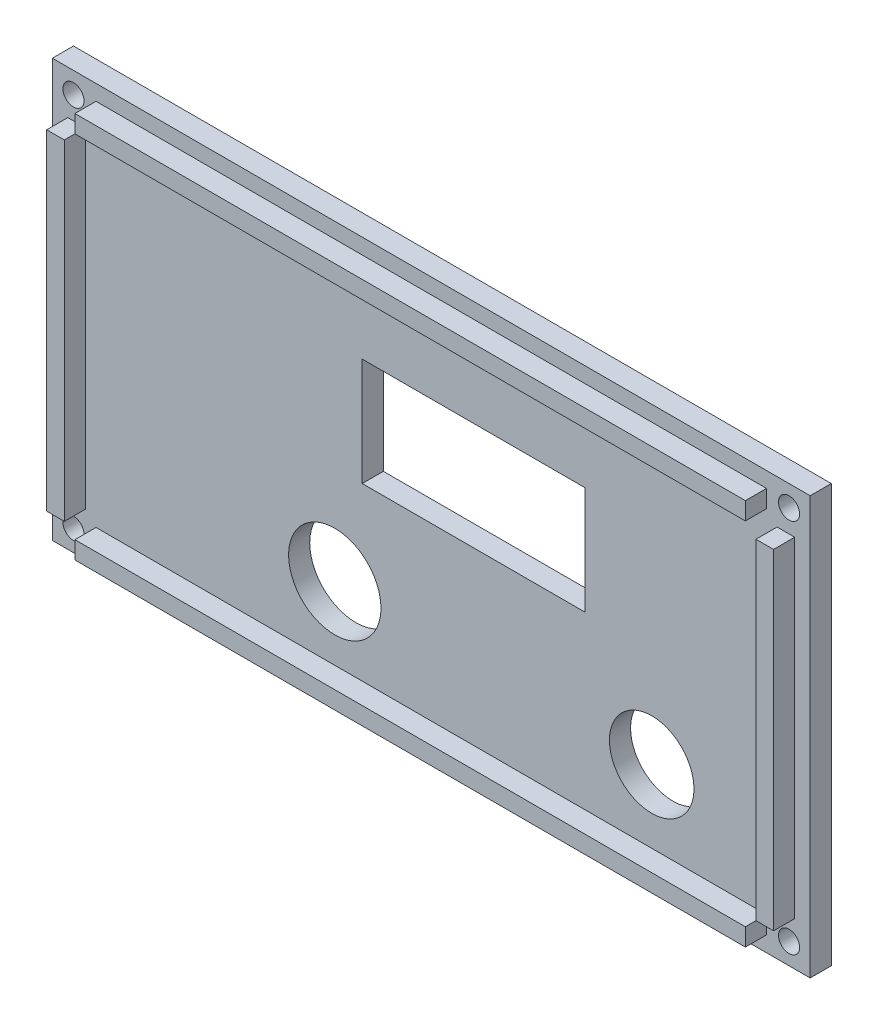
ISO-10303-21;
HEADER;
FILE_DESCRIPTION(('STEP AP214'),'2;1');
FILE_NAME('part.step','',(''),(''),'','','');
FILE_SCHEMA(('AUTOMOTIVE_DESIGN { 1 0 10303 214 1 1 1 1 }'));
ENDSEC;
DATA;
#1=APPLICATION_CONTEXT('core data for automotive mechanical design processes');
#2=APPLICATION_PROTOCOL_DEFINITION('international standard','automotive_design',2000,#1);
#3=PRODUCT_CONTEXT('',#1,'mechanical');
#4=PRODUCT('Part','Part','',(#3));
#5=PRODUCT_RELATED_PRODUCT_CATEGORY('part','',(#4));
#6=PRODUCT_DEFINITION_FORMATION('','',#4);
#7=PRODUCT_DEFINITION_CONTEXT('part definition',#1,'design');
#8=PRODUCT_DEFINITION('design','',#6,#7);
#9=PRODUCT_DEFINITION_SHAPE('','',#8);
#10=(LENGTH_UNIT() NAMED_UNIT(*) SI_UNIT(.MILLI.,.METRE.));
#11=(NAMED_UNIT(*) PLANE_ANGLE_UNIT() SI_UNIT($,.RADIAN.));
#12=(NAMED_UNIT(*) SI_UNIT($,.STERADIAN.) SOLID_ANGLE_UNIT());
#13=UNCERTAINTY_MEASURE_WITH_UNIT(LENGTH_MEASURE(1.E-05),#10,'distance_accuracy_value','');
#14=(GEOMETRIC_REPRESENTATION_CONTEXT(3) GLOBAL_UNCERTAINTY_ASSIGNED_CONTEXT((#13)) GLOBAL_UNIT_ASSIGNED_CONTEXT((#10,
#11,#12)) REPRESENTATION_CONTEXT('',''));
#15=CARTESIAN_POINT('',(0.,0.,0.));
#16=DIRECTION('',(0.,0.,1.));
#17=DIRECTION('',(1.,0.,0.));
#18=AXIS2_PLACEMENT_3D('',#15,#16,#17);
#19=CARTESIAN_POINT('',(0.,0.,3.));
#20=DIRECTION('',(0.,0.,-1.));
#21=DIRECTION('',(-1.,0.,0.));
#22=AXIS2_PLACEMENT_3D('',#19,#20,#21);
#23=PLANE('',#22);
#24=DIRECTION('',(1.,0.,0.));
#25=VECTOR('',#24,1.);
#26=CARTESIAN_POINT('',(0.,44.3,3.));
#27=LINE('',#26,#25);
#28=CARTESIAN_POINT('',(44.,44.3,3.));
#29=VERTEX_POINT('',#28);
#30=CARTESIAN_POINT('',(75.6,44.3,3.));
#31=VERTEX_POINT('',#30);
#32=EDGE_CURVE('E263',#29,#31,#27,.T.);
#33=ORIENTED_EDGE('',*,*,#32,.T.);
#34=DIRECTION('',(0.,-1.,0.));
#35=VECTOR('',#34,1.);
#36=CARTESIAN_POINT('',(75.6,0.,3.));
#37=LINE('',#36,#35);
#38=CARTESIAN_POINT('',(75.6,29.,3.));
#39=VERTEX_POINT('',#38);
#40=EDGE_CURVE('E203',#31,#39,#37,.T.);
#41=ORIENTED_EDGE('',*,*,#40,.T.);
#42=DIRECTION('',(-1.,0.,0.));
#43=VECTOR('',#42,1.);
#44=CARTESIAN_POINT('',(0.,29.,3.));
#45=LINE('',#44,#43);
#46=CARTESIAN_POINT('',(44.,29.,3.));
#47=VERTEX_POINT('',#46);
#48=EDGE_CURVE('E257',#39,#47,#45,.T.);
#49=ORIENTED_EDGE('',*,*,#48,.T.);
#50=DIRECTION('',(0.,1.,0.));
#51=VECTOR('',#50,1.);
#52=CARTESIAN_POINT('',(44.,0.,3.));
#53=LINE('',#52,#51);
#54=EDGE_CURVE('E260',#47,#29,#53,.T.);
#55=ORIENTED_EDGE('',*,*,#54,.T.);
#56=EDGE_LOOP('',(#33,#41,#49,#55));
#57=FACE_BOUND('',#56,.T.);
#58=CARTESIAN_POINT('',(3.00000000000002,56.3,3.));
#59=DIRECTION('',(0.,0.,-1.));
#60=DIRECTION('',(-1.,0.,0.));
#61=AXIS2_PLACEMENT_3D('',#58,#59,#60);
#62=CIRCLE('',#61,1.5);
#63=CARTESIAN_POINT('',(1.50000000000002,56.3,3.));
#64=VERTEX_POINT('',#63);
#65=EDGE_CURVE('E254',#64,#64,#62,.T.);
#66=ORIENTED_EDGE('',*,*,#65,.T.);
#67=EDGE_LOOP('',(#66));
#68=FACE_BOUND('',#67,.T.);
#69=CARTESIAN_POINT('',(3.00000000000002,3.,3.));
#70=DIRECTION('',(0.,0.,-1.));
#71=DIRECTION('',(-1.,0.,0.));
#72=AXIS2_PLACEMENT_3D('',#69,#70,#71);
#73=CIRCLE('',#72,1.5);
#74=CARTESIAN_POINT('',(1.50000000000002,3.,3.));
#75=VERTEX_POINT('',#74);
#76=EDGE_CURVE('E251',#75,#75,#73,.T.);
#77=ORIENTED_EDGE('',*,*,#76,.T.);
#78=EDGE_LOOP('',(#77));
#79=FACE_BOUND('',#78,.T.);
#80=CARTESIAN_POINT('',(104.6,3.,3.));
#81=DIRECTION('',(0.,0.,-1.));
#82=DIRECTION('',(-1.,0.,0.));
#83=AXIS2_PLACEMENT_3D('',#80,#81,#82);
#84=CIRCLE('',#83,1.5);
#85=CARTESIAN_POINT('',(103.1,3.,3.));
#86=VERTEX_POINT('',#85);
#87=EDGE_CURVE('E248',#86,#86,#84,.T.);
#88=ORIENTED_EDGE('',*,*,#87,.T.);
#89=EDGE_LOOP('',(#88));
#90=FACE_BOUND('',#89,.T.);
#91=CARTESIAN_POINT('',(85.1,15.,3.));
#92=DIRECTION('',(0.,0.,-1.));
#93=DIRECTION('',(-1.,0.,0.));
#94=AXIS2_PLACEMENT_3D('',#91,#92,#93);
#95=CIRCLE('',#94,6.);
#96=CARTESIAN_POINT('',(79.1,15.,3.));
#97=VERTEX_POINT('',#96);
#98=EDGE_CURVE('E245',#97,#97,#95,.T.);
#99=ORIENTED_EDGE('',*,*,#98,.T.);
#100=EDGE_LOOP('',(#99));
#101=FACE_BOUND('',#100,.T.);
#102=CARTESIAN_POINT('',(40.1,15.,3.));
#103=DIRECTION('',(0.,0.,-1.));
#104=DIRECTION('',(-1.,0.,0.));
#105=AXIS2_PLACEMENT_3D('',#102,#103,#104);
#106=CIRCLE('',#105,6.55755261290737);
#107=CARTESIAN_POINT('',(33.5424473870926,15.,3.));
#108=VERTEX_POINT('',#107);
#109=EDGE_CURVE('E242',#108,#108,#106,.T.);
#110=ORIENTED_EDGE('',*,*,#109,.T.);
#111=EDGE_LOOP('',(#110));
#112=FACE_BOUND('',#111,.T.);
#113=CARTESIAN_POINT('',(104.6,56.3,3.));
#114=DIRECTION('',(0.,0.,-1.));
#115=DIRECTION('',(-1.,0.,0.));
#116=AXIS2_PLACEMENT_3D('',#113,#114,#115);
#117=CIRCLE('',#116,1.5);
#118=CARTESIAN_POINT('',(103.1,56.3,3.));
#119=VERTEX_POINT('',#118);
#120=EDGE_CURVE('E226',#119,#119,#117,.T.);
#121=ORIENTED_EDGE('',*,*,#120,.T.);
#122=EDGE_LOOP('',(#121));
#123=FACE_BOUND('',#122,.T.);
#124=DIRECTION('',(0.,-1.,0.));
#125=VECTOR('',#124,1.);
#126=CARTESIAN_POINT('',(6.2,4.7,3.));
#127=LINE('',#126,#125);
#128=CARTESIAN_POINT('',(6.2,4.7,3.));
#129=VERTEX_POINT('',#128);
#130=CARTESIAN_POINT('',(6.2,2.2,3.));
#131=VERTEX_POINT('',#130);
#132=EDGE_CURVE('E322',#129,#131,#127,.T.);
#133=ORIENTED_EDGE('',*,*,#132,.F.);
#134=DIRECTION('',(-1.,0.,0.));
#135=VECTOR('',#134,1.);
#136=CARTESIAN_POINT('',(6.2,4.7,3.));
#137=LINE('',#136,#135);
#138=CARTESIAN_POINT('',(101.4,4.7,3.));
#139=VERTEX_POINT('',#138);
#140=EDGE_CURVE('E312',#139,#129,#137,.T.);
#141=ORIENTED_EDGE('',*,*,#140,.F.);
#142=DIRECTION('',(0.,1.,0.));
#143=VECTOR('',#142,1.);
#144=CARTESIAN_POINT('',(101.4,4.7,3.));
#145=LINE('',#144,#143);
#146=CARTESIAN_POINT('',(101.4,2.2,3.));
#147=VERTEX_POINT('',#146);
#148=EDGE_CURVE('E315',#147,#139,#145,.T.);
#149=ORIENTED_EDGE('',*,*,#148,.F.);
#150=DIRECTION('',(1.,0.,0.));
#151=VECTOR('',#150,1.);
#152=CARTESIAN_POINT('',(6.2,2.2,3.));
#153=LINE('',#152,#151);
#154=EDGE_CURVE('E319',#131,#147,#153,.T.);
#155=ORIENTED_EDGE('',*,*,#154,.F.);
#156=EDGE_LOOP('',(#133,#141,#149,#155));
#157=FACE_BOUND('',#156,.T.);
#158=DIRECTION('',(0.,-1.,0.));
#159=VECTOR('',#158,1.);
#160=CARTESIAN_POINT('',(6.2,57.1,3.));
#161=LINE('',#160,#159);
#162=CARTESIAN_POINT('',(6.2,57.1,3.));
#163=VERTEX_POINT('',#162);
#164=CARTESIAN_POINT('',(6.2,54.6,3.));
#165=VERTEX_POINT('',#164);
#166=EDGE_CURVE('E358',#163,#165,#161,.T.);
#167=ORIENTED_EDGE('',*,*,#166,.F.);
#168=DIRECTION('',(-1.,0.,0.));
#169=VECTOR('',#168,1.);
#170=CARTESIAN_POINT('',(6.2,57.1,3.));
#171=LINE('',#170,#169);
#172=CARTESIAN_POINT('',(101.4,57.1,3.));
#173=VERTEX_POINT('',#172);
#174=EDGE_CURVE('E370',#173,#163,#171,.T.);
#175=ORIENTED_EDGE('',*,*,#174,.F.);
#176=DIRECTION('',(0.,1.,0.));
#177=VECTOR('',#176,1.);
#178=CARTESIAN_POINT('',(101.4,57.1,3.));
#179=LINE('',#178,#177);
#180=CARTESIAN_POINT('',(101.4,54.6,3.));
#181=VERTEX_POINT('',#180);
#182=EDGE_CURVE('E382',#181,#173,#179,.T.);
#183=ORIENTED_EDGE('',*,*,#182,.F.);
#184=DIRECTION('',(1.,0.,0.));
#185=VECTOR('',#184,1.);
#186=CARTESIAN_POINT('',(6.2,54.6,3.));
#187=LINE('',#186,#185);
#188=EDGE_CURVE('E379',#165,#181,#187,.T.);
#189=ORIENTED_EDGE('',*,*,#188,.F.);
#190=EDGE_LOOP('',(#167,#175,#183,#189));
#191=FACE_BOUND('',#190,.T.);
#192=DIRECTION('',(0.,-1.,0.));
#193=VECTOR('',#192,1.);
#194=CARTESIAN_POINT('',(0.,0.,3.));
#195=LINE('',#194,#193);
#196=CARTESIAN_POINT('',(0.,59.3,3.));
#197=VERTEX_POINT('',#196);
#198=CARTESIAN_POINT('',(0.,0.,3.));
#199=VERTEX_POINT('',#198);
#200=EDGE_CURVE('E399',#197,#199,#195,.T.);
#201=ORIENTED_EDGE('',*,*,#200,.T.);
#202=DIRECTION('',(1.,0.,0.));
#203=VECTOR('',#202,1.);
#204=CARTESIAN_POINT('',(0.,0.,3.));
#205=LINE('',#204,#203);
#206=CARTESIAN_POINT('',(107.6,0.,3.));
#207=VERTEX_POINT('',#206);
#208=EDGE_CURVE('E402',#199,#207,#205,.T.);
#209=ORIENTED_EDGE('',*,*,#208,.T.);
#210=DIRECTION('',(0.,1.,0.));
#211=VECTOR('',#210,1.);
#212=CARTESIAN_POINT('',(107.6,0.,3.));
#213=LINE('',#212,#211);
#214=CARTESIAN_POINT('',(107.6,59.3,3.));
#215=VERTEX_POINT('',#214);
#216=EDGE_CURVE('E405',#207,#215,#213,.T.);
#217=ORIENTED_EDGE('',*,*,#216,.T.);
#218=DIRECTION('',(-1.,0.,0.));
#219=VECTOR('',#218,1.);
#220=CARTESIAN_POINT('',(0.,59.3,3.));
#221=LINE('',#220,#219);
#222=EDGE_CURVE('E407',#215,#197,#221,.T.);
#223=ORIENTED_EDGE('',*,*,#222,.T.);
#224=EDGE_LOOP('',(#201,#209,#217,#223));
#225=FACE_BOUND('',#224,.T.);
#226=DIRECTION('',(0.,-1.,0.));
#227=VECTOR('',#226,1.);
#228=CARTESIAN_POINT('',(2.2,53.1,3.));
#229=LINE('',#228,#227);
#230=CARTESIAN_POINT('',(2.2,53.1,3.));
#231=VERTEX_POINT('',#230);
#232=CARTESIAN_POINT('',(2.20000000000001,6.2,3.));
#233=VERTEX_POINT('',#232);
#234=EDGE_CURVE('E355',#231,#233,#229,.T.);
#235=ORIENTED_EDGE('',*,*,#234,.F.);
#236=DIRECTION('',(-1.,0.,0.));
#237=VECTOR('',#236,1.);
#238=CARTESIAN_POINT('',(2.2,53.1,3.));
#239=LINE('',#238,#237);
#240=CARTESIAN_POINT('',(4.7,53.1,3.));
#241=VERTEX_POINT('',#240);
#242=EDGE_CURVE('E345',#241,#231,#239,.T.);
#243=ORIENTED_EDGE('',*,*,#242,.F.);
#244=DIRECTION('',(0.,1.,0.));
#245=VECTOR('',#244,1.);
#246=CARTESIAN_POINT('',(4.7,53.1,3.));
#247=LINE('',#246,#245);
#248=CARTESIAN_POINT('',(4.70000000000001,6.2,3.));
#249=VERTEX_POINT('',#248);
#250=EDGE_CURVE('E348',#249,#241,#247,.T.);
#251=ORIENTED_EDGE('',*,*,#250,.F.);
#252=DIRECTION('',(1.,0.,0.));
#253=VECTOR('',#252,1.);
#254=CARTESIAN_POINT('',(2.20000000000001,6.2,3.));
#255=LINE('',#254,#253);
#256=EDGE_CURVE('E352',#233,#249,#255,.T.);
#257=ORIENTED_EDGE('',*,*,#256,.F.);
#258=EDGE_LOOP('',(#235,#243,#251,#257));
#259=FACE_BOUND('',#258,.T.);
#260=DIRECTION('',(0.,1.,0.));
#261=VECTOR('',#260,1.);
#262=CARTESIAN_POINT('',(105.4,53.1,3.));
#263=LINE('',#262,#261);
#264=CARTESIAN_POINT('',(105.4,6.2,3.));
#265=VERTEX_POINT('',#264);
#266=CARTESIAN_POINT('',(105.4,53.1,3.));
#267=VERTEX_POINT('',#266);
#268=EDGE_CURVE('E289',#265,#267,#263,.T.);
#269=ORIENTED_EDGE('',*,*,#268,.F.);
#270=DIRECTION('',(1.,0.,0.));
#271=VECTOR('',#270,1.);
#272=CARTESIAN_POINT('',(105.4,6.2,3.));
#273=LINE('',#272,#271);
#274=CARTESIAN_POINT('',(102.9,6.2,3.));
#275=VERTEX_POINT('',#274);
#276=EDGE_CURVE('E279',#275,#265,#273,.T.);
#277=ORIENTED_EDGE('',*,*,#276,.F.);
#278=DIRECTION('',(0.,-1.,0.));
#279=VECTOR('',#278,1.);
#280=CARTESIAN_POINT('',(102.9,53.1,3.));
#281=LINE('',#280,#279);
#282=CARTESIAN_POINT('',(102.9,53.1,3.));
#283=VERTEX_POINT('',#282);
#284=EDGE_CURVE('E282',#283,#275,#281,.T.);
#285=ORIENTED_EDGE('',*,*,#284,.F.);
#286=DIRECTION('',(-1.,0.,0.));
#287=VECTOR('',#286,1.);
#288=CARTESIAN_POINT('',(105.4,53.1,3.));
#289=LINE('',#288,#287);
#290=EDGE_CURVE('E286',#267,#283,#289,.T.);
#291=ORIENTED_EDGE('',*,*,#290,.F.);
#292=EDGE_LOOP('',(#269,#277,#285,#291));
#293=FACE_BOUND('',#292,.T.);
#294=ADVANCED_FACE('F39',(#57,#68,#79,#90,#101,#112,#123,#157,#191,#225,#259,#293),#23,.F.);
#295=CARTESIAN_POINT('',(0.,0.,3.));
#296=DIRECTION('',(1.,0.,0.));
#297=DIRECTION('',(0.,0.,-1.));
#298=AXIS2_PLACEMENT_3D('',#295,#296,#297);
#299=PLANE('',#298);
#300=DIRECTION('',(0.,-1.,0.));
#301=VECTOR('',#300,1.);
#302=CARTESIAN_POINT('',(0.,0.,0.));
#303=LINE('',#302,#301);
#304=CARTESIAN_POINT('',(0.,59.3,0.));
#305=VERTEX_POINT('',#304);
#306=CARTESIAN_POINT('',(0.,0.,0.));
#307=VERTEX_POINT('',#306);
#308=EDGE_CURVE('E398',#305,#307,#303,.T.);
#309=ORIENTED_EDGE('',*,*,#308,.T.);
#310=DIRECTION('',(0.,0.,-1.));
#311=VECTOR('',#310,1.);
#312=CARTESIAN_POINT('',(0.,0.,3.));
#313=LINE('',#312,#311);
#314=EDGE_CURVE('E11',#199,#307,#313,.T.);
#315=ORIENTED_EDGE('',*,*,#314,.F.);
#316=ORIENTED_EDGE('',*,*,#200,.F.);
#317=DIRECTION('',(0.,0.,-1.));
#318=VECTOR('',#317,1.);
#319=CARTESIAN_POINT('',(0.,59.3,3.));
#320=LINE('',#319,#318);
#321=EDGE_CURVE('E409',#197,#305,#320,.T.);
#322=ORIENTED_EDGE('',*,*,#321,.T.);
#323=EDGE_LOOP('',(#309,#315,#316,#322));
#324=FACE_BOUND('',#323,.T.);
#325=ADVANCED_FACE('F41',(#324),#299,.F.);
#326=CARTESIAN_POINT('',(0.,0.,3.));
#327=DIRECTION('',(0.,1.,0.));
#328=DIRECTION('',(0.,0.,1.));
#329=AXIS2_PLACEMENT_3D('',#326,#327,#328);
#330=PLANE('',#329);
#331=DIRECTION('',(1.,0.,0.));
#332=VECTOR('',#331,1.);
#333=CARTESIAN_POINT('',(0.,0.,0.));
#334=LINE('',#333,#332);
#335=CARTESIAN_POINT('',(107.6,0.,0.));
#336=VERTEX_POINT('',#335);
#337=EDGE_CURVE('E412',#307,#336,#334,.T.);
#338=ORIENTED_EDGE('',*,*,#337,.T.);
#339=DIRECTION('',(0.,0.,-1.));
#340=VECTOR('',#339,1.);
#341=CARTESIAN_POINT('',(107.6,0.,3.));
#342=LINE('',#341,#340);
#343=EDGE_CURVE('E47',#207,#336,#342,.T.);
#344=ORIENTED_EDGE('',*,*,#343,.F.);
#345=ORIENTED_EDGE('',*,*,#208,.F.);
#346=ORIENTED_EDGE('',*,*,#314,.T.);
#347=EDGE_LOOP('',(#338,#344,#345,#346));
#348=FACE_BOUND('',#347,.T.);
#349=ADVANCED_FACE('F441',(#348),#330,.F.);
#350=CARTESIAN_POINT('',(107.6,0.,3.));
#351=DIRECTION('',(-1.,0.,0.));
#352=DIRECTION('',(0.,0.,1.));
#353=AXIS2_PLACEMENT_3D('',#350,#351,#352);
#354=PLANE('',#353);
#355=DIRECTION('',(0.,1.,0.));
#356=VECTOR('',#355,1.);
#357=CARTESIAN_POINT('',(107.6,0.,0.));
#358=LINE('',#357,#356);
#359=CARTESIAN_POINT('',(107.6,59.3,0.));
#360=VERTEX_POINT('',#359);
#361=EDGE_CURVE('E414',#336,#360,#358,.T.);
#362=ORIENTED_EDGE('',*,*,#361,.T.);
#363=DIRECTION('',(0.,0.,-1.));
#364=VECTOR('',#363,1.);
#365=CARTESIAN_POINT('',(107.6,59.3,3.));
#366=LINE('',#365,#364);
#367=EDGE_CURVE('E419',#215,#360,#366,.T.);
#368=ORIENTED_EDGE('',*,*,#367,.F.);
#369=ORIENTED_EDGE('',*,*,#216,.F.);
#370=ORIENTED_EDGE('',*,*,#343,.T.);
#371=EDGE_LOOP('',(#362,#368,#369,#370));
#372=FACE_BOUND('',#371,.T.);
#373=ADVANCED_FACE('F426',(#372),#354,.F.);
#374=CARTESIAN_POINT('',(0.,59.3,3.));
#375=DIRECTION('',(0.,-1.,0.));
#376=DIRECTION('',(0.,0.,-1.));
#377=AXIS2_PLACEMENT_3D('',#374,#375,#376);
#378=PLANE('',#377);
#379=DIRECTION('',(-1.,0.,0.));
#380=VECTOR('',#379,1.);
#381=CARTESIAN_POINT('',(0.,59.3,0.));
#382=LINE('',#381,#380);
#383=EDGE_CURVE('E403',#360,#305,#382,.T.);
#384=ORIENTED_EDGE('',*,*,#383,.T.);
#385=ORIENTED_EDGE('',*,*,#321,.F.);
#386=ORIENTED_EDGE('',*,*,#222,.F.);
#387=ORIENTED_EDGE('',*,*,#367,.T.);
#388=EDGE_LOOP('',(#384,#385,#386,#387));
#389=FACE_BOUND('',#388,.T.);
#390=ADVANCED_FACE('F434',(#389),#378,.F.);
#391=CARTESIAN_POINT('',(0.,0.,0.));
#392=DIRECTION('',(0.,0.,-1.));
#393=DIRECTION('',(-1.,0.,0.));
#394=AXIS2_PLACEMENT_3D('',#391,#392,#393);
#395=PLANE('',#394);
#396=DIRECTION('',(0.,-1.,0.));
#397=VECTOR('',#396,1.);
#398=CARTESIAN_POINT('',(75.6,44.3,0.));
#399=LINE('',#398,#397);
#400=CARTESIAN_POINT('',(75.6,44.3,0.));
#401=VERTEX_POINT('',#400);
#402=CARTESIAN_POINT('',(75.6,29.,0.));
#403=VERTEX_POINT('',#402);
#404=EDGE_CURVE('E62',#401,#403,#399,.T.);
#405=ORIENTED_EDGE('',*,*,#404,.F.);
#406=DIRECTION('',(1.,0.,0.));
#407=VECTOR('',#406,1.);
#408=CARTESIAN_POINT('',(75.6,44.3,0.));
#409=LINE('',#408,#407);
#410=CARTESIAN_POINT('',(44.,44.3,0.));
#411=VERTEX_POINT('',#410);
#412=EDGE_CURVE('E210',#411,#401,#409,.T.);
#413=ORIENTED_EDGE('',*,*,#412,.F.);
#414=DIRECTION('',(0.,1.,0.));
#415=VECTOR('',#414,1.);
#416=CARTESIAN_POINT('',(44.,44.3,0.));
#417=LINE('',#416,#415);
#418=CARTESIAN_POINT('',(44.,29.,0.));
#419=VERTEX_POINT('',#418);
#420=EDGE_CURVE('E216',#419,#411,#417,.T.);
#421=ORIENTED_EDGE('',*,*,#420,.F.);
#422=DIRECTION('',(-1.,0.,0.));
#423=VECTOR('',#422,1.);
#424=CARTESIAN_POINT('',(75.6,29.,0.));
#425=LINE('',#424,#423);
#426=EDGE_CURVE('E222',#403,#419,#425,.T.);
#427=ORIENTED_EDGE('',*,*,#426,.F.);
#428=EDGE_LOOP('',(#405,#413,#421,#427));
#429=FACE_BOUND('',#428,.T.);
#430=CARTESIAN_POINT('',(3.00000000000002,56.3,0.));
#431=DIRECTION('',(0.,0.,-1.));
#432=DIRECTION('',(-1.,0.,0.));
#433=AXIS2_PLACEMENT_3D('',#430,#431,#432);
#434=CIRCLE('',#433,1.5);
#435=CARTESIAN_POINT('',(1.50000000000002,56.3,0.));
#436=VERTEX_POINT('',#435);
#437=EDGE_CURVE('E207',#436,#436,#434,.T.);
#438=ORIENTED_EDGE('',*,*,#437,.F.);
#439=EDGE_LOOP('',(#438));
#440=FACE_BOUND('',#439,.T.);
#441=CARTESIAN_POINT('',(3.00000000000002,3.,0.));
#442=DIRECTION('',(0.,0.,-1.));
#443=DIRECTION('',(-1.,0.,0.));
#444=AXIS2_PLACEMENT_3D('',#441,#442,#443);
#445=CIRCLE('',#444,1.5);
#446=CARTESIAN_POINT('',(1.50000000000002,3.,0.));
#447=VERTEX_POINT('',#446);
#448=EDGE_CURVE('E233',#447,#447,#445,.T.);
#449=ORIENTED_EDGE('',*,*,#448,.F.);
#450=EDGE_LOOP('',(#449));
#451=FACE_BOUND('',#450,.T.);
#452=CARTESIAN_POINT('',(104.6,3.,0.));
#453=DIRECTION('',(0.,0.,-1.));
#454=DIRECTION('',(-1.,0.,0.));
#455=AXIS2_PLACEMENT_3D('',#452,#453,#454);
#456=CIRCLE('',#455,1.5);
#457=CARTESIAN_POINT('',(103.1,3.,0.));
#458=VERTEX_POINT('',#457);
#459=EDGE_CURVE('E236',#458,#458,#456,.T.);
#460=ORIENTED_EDGE('',*,*,#459,.F.);
#461=EDGE_LOOP('',(#460));
#462=FACE_BOUND('',#461,.T.);
#463=CARTESIAN_POINT('',(85.1,15.,0.));
#464=DIRECTION('',(0.,0.,-1.));
#465=DIRECTION('',(-1.,0.,0.));
#466=AXIS2_PLACEMENT_3D('',#463,#464,#465);
#467=CIRCLE('',#466,6.);
#468=CARTESIAN_POINT('',(79.1,15.,0.));
#469=VERTEX_POINT('',#468);
#470=EDGE_CURVE('E238',#469,#469,#467,.T.);
#471=ORIENTED_EDGE('',*,*,#470,.F.);
#472=EDGE_LOOP('',(#471));
#473=FACE_BOUND('',#472,.T.);
#474=CARTESIAN_POINT('',(40.1,15.,0.));
#475=DIRECTION('',(0.,0.,-1.));
#476=DIRECTION('',(-1.,0.,0.));
#477=AXIS2_PLACEMENT_3D('',#474,#475,#476);
#478=CIRCLE('',#477,6.55755261290737);
#479=CARTESIAN_POINT('',(33.5424473870926,15.,0.));
#480=VERTEX_POINT('',#479);
#481=EDGE_CURVE('E745',#480,#480,#478,.T.);
#482=ORIENTED_EDGE('',*,*,#481,.F.);
#483=EDGE_LOOP('',(#482));
#484=FACE_BOUND('',#483,.T.);
#485=CARTESIAN_POINT('',(104.6,56.3,0.));
#486=DIRECTION('',(0.,0.,-1.));
#487=DIRECTION('',(-1.,0.,0.));
#488=AXIS2_PLACEMENT_3D('',#485,#486,#487);
#489=CIRCLE('',#488,1.5);
#490=CARTESIAN_POINT('',(103.1,56.3,0.));
#491=VERTEX_POINT('',#490);
#492=EDGE_CURVE('E223',#491,#491,#489,.T.);
#493=ORIENTED_EDGE('',*,*,#492,.F.);
#494=EDGE_LOOP('',(#493));
#495=FACE_BOUND('',#494,.T.);
#496=ORIENTED_EDGE('',*,*,#308,.F.);
#497=ORIENTED_EDGE('',*,*,#383,.F.);
#498=ORIENTED_EDGE('',*,*,#361,.F.);
#499=ORIENTED_EDGE('',*,*,#337,.F.);
#500=EDGE_LOOP('',(#496,#497,#498,#499));
#501=FACE_BOUND('',#500,.T.);
#502=ADVANCED_FACE('F220',(#429,#440,#451,#462,#473,#484,#495,#501),#395,.T.);
#503=CARTESIAN_POINT('',(6.2,57.1,6.));
#504=DIRECTION('',(1.,0.,0.));
#505=DIRECTION('',(0.,0.,-1.));
#506=AXIS2_PLACEMENT_3D('',#503,#504,#505);
#507=PLANE('',#506);
#508=ORIENTED_EDGE('',*,*,#166,.T.);
#509=DIRECTION('',(0.,0.,-1.));
#510=VECTOR('',#509,1.);
#511=CARTESIAN_POINT('',(6.2,54.6,6.));
#512=LINE('',#511,#510);
#513=CARTESIAN_POINT('',(6.2,54.6,6.));
#514=VERTEX_POINT('',#513);
#515=EDGE_CURVE('E395',#514,#165,#512,.T.);
#516=ORIENTED_EDGE('',*,*,#515,.F.);
#517=DIRECTION('',(0.,-1.,0.));
#518=VECTOR('',#517,1.);
#519=CARTESIAN_POINT('',(6.2,57.1,6.));
#520=LINE('',#519,#518);
#521=CARTESIAN_POINT('',(6.2,57.1,6.));
#522=VERTEX_POINT('',#521);
#523=EDGE_CURVE('E366',#522,#514,#520,.T.);
#524=ORIENTED_EDGE('',*,*,#523,.F.);
#525=DIRECTION('',(0.,0.,-1.));
#526=VECTOR('',#525,1.);
#527=CARTESIAN_POINT('',(6.2,57.1,6.));
#528=LINE('',#527,#526);
#529=EDGE_CURVE('E376',#522,#163,#528,.T.);
#530=ORIENTED_EDGE('',*,*,#529,.T.);
#531=EDGE_LOOP('',(#508,#516,#524,#530));
#532=FACE_BOUND('',#531,.T.);
#533=ADVANCED_FACE('F458',(#532),#507,.F.);
#534=CARTESIAN_POINT('',(6.2,54.6,6.));
#535=DIRECTION('',(0.,1.,0.));
#536=DIRECTION('',(0.,0.,1.));
#537=AXIS2_PLACEMENT_3D('',#534,#535,#536);
#538=PLANE('',#537);
#539=ORIENTED_EDGE('',*,*,#188,.T.);
#540=DIRECTION('',(0.,0.,-1.));
#541=VECTOR('',#540,1.);
#542=CARTESIAN_POINT('',(101.4,54.6,6.));
#543=LINE('',#542,#541);
#544=CARTESIAN_POINT('',(101.4,54.6,6.));
#545=VERTEX_POINT('',#544);
#546=EDGE_CURVE('E392',#545,#181,#543,.T.);
#547=ORIENTED_EDGE('',*,*,#546,.F.);
#548=DIRECTION('',(1.,0.,0.));
#549=VECTOR('',#548,1.);
#550=CARTESIAN_POINT('',(6.2,54.6,6.));
#551=LINE('',#550,#549);
#552=EDGE_CURVE('E369',#514,#545,#551,.T.);
#553=ORIENTED_EDGE('',*,*,#552,.F.);
#554=ORIENTED_EDGE('',*,*,#515,.T.);
#555=EDGE_LOOP('',(#539,#547,#553,#554));
#556=FACE_BOUND('',#555,.T.);
#557=ADVANCED_FACE('F474',(#556),#538,.F.);
#558=CARTESIAN_POINT('',(101.4,57.1,6.));
#559=DIRECTION('',(-1.,0.,0.));
#560=DIRECTION('',(0.,0.,1.));
#561=AXIS2_PLACEMENT_3D('',#558,#559,#560);
#562=PLANE('',#561);
#563=ORIENTED_EDGE('',*,*,#182,.T.);
#564=DIRECTION('',(0.,0.,-1.));
#565=VECTOR('',#564,1.);
#566=CARTESIAN_POINT('',(101.4,57.1,6.));
#567=LINE('',#566,#565);
#568=CARTESIAN_POINT('',(101.4,57.1,6.));
#569=VERTEX_POINT('',#568);
#570=EDGE_CURVE('E389',#569,#173,#567,.T.);
#571=ORIENTED_EDGE('',*,*,#570,.F.);
#572=DIRECTION('',(0.,1.,0.));
#573=VECTOR('',#572,1.);
#574=CARTESIAN_POINT('',(101.4,57.1,6.));
#575=LINE('',#574,#573);
#576=EDGE_CURVE('E372',#545,#569,#575,.T.);
#577=ORIENTED_EDGE('',*,*,#576,.F.);
#578=ORIENTED_EDGE('',*,*,#546,.T.);
#579=EDGE_LOOP('',(#563,#571,#577,#578));
#580=FACE_BOUND('',#579,.T.);
#581=ADVANCED_FACE('F482',(#580),#562,.F.);
#582=CARTESIAN_POINT('',(6.2,57.1,6.));
#583=DIRECTION('',(0.,-1.,0.));
#584=DIRECTION('',(0.,0.,-1.));
#585=AXIS2_PLACEMENT_3D('',#582,#583,#584);
#586=PLANE('',#585);
#587=ORIENTED_EDGE('',*,*,#174,.T.);
#588=ORIENTED_EDGE('',*,*,#529,.F.);
#589=DIRECTION('',(-1.,0.,0.));
#590=VECTOR('',#589,1.);
#591=CARTESIAN_POINT('',(6.2,57.1,6.));
#592=LINE('',#591,#590);
#593=EDGE_CURVE('E374',#569,#522,#592,.T.);
#594=ORIENTED_EDGE('',*,*,#593,.F.);
#595=ORIENTED_EDGE('',*,*,#570,.T.);
#596=EDGE_LOOP('',(#587,#588,#594,#595));
#597=FACE_BOUND('',#596,.T.);
#598=ADVANCED_FACE('F490',(#597),#586,.F.);
#599=CARTESIAN_POINT('',(0.,0.,6.));
#600=DIRECTION('',(0.,0.,1.));
#601=DIRECTION('',(1.,0.,0.));
#602=AXIS2_PLACEMENT_3D('',#599,#600,#601);
#603=PLANE('',#602);
#604=ORIENTED_EDGE('',*,*,#523,.T.);
#605=ORIENTED_EDGE('',*,*,#552,.T.);
#606=ORIENTED_EDGE('',*,*,#576,.T.);
#607=ORIENTED_EDGE('',*,*,#593,.T.);
#608=EDGE_LOOP('',(#604,#605,#606,#607));
#609=FACE_BOUND('',#608,.T.);
#610=ADVANCED_FACE('F499',(#609),#603,.T.);
#611=CARTESIAN_POINT('',(2.2,53.1,6.));
#612=DIRECTION('',(1.,0.,0.));
#613=DIRECTION('',(0.,1.,0.));
#614=AXIS2_PLACEMENT_3D('',#611,#612,#613);
#615=PLANE('',#614);
#616=ORIENTED_EDGE('',*,*,#234,.T.);
#617=DIRECTION('',(0.,0.,-1.));
#618=VECTOR('',#617,1.);
#619=CARTESIAN_POINT('',(2.20000000000001,6.2,6.));
#620=LINE('',#619,#618);
#621=CARTESIAN_POINT('',(2.20000000000001,6.2,6.));
#622=VERTEX_POINT('',#621);
#623=EDGE_CURVE('E325',#622,#233,#620,.T.);
#624=ORIENTED_EDGE('',*,*,#623,.F.);
#625=DIRECTION('',(0.,-1.,0.));
#626=VECTOR('',#625,1.);
#627=CARTESIAN_POINT('',(2.2,53.1,6.));
#628=LINE('',#627,#626);
#629=CARTESIAN_POINT('',(2.2,53.1,6.));
#630=VERTEX_POINT('',#629);
#631=EDGE_CURVE('E349',#630,#622,#628,.T.);
#632=ORIENTED_EDGE('',*,*,#631,.F.);
#633=DIRECTION('',(0.,0.,-1.));
#634=VECTOR('',#633,1.);
#635=CARTESIAN_POINT('',(2.2,53.1,6.));
#636=LINE('',#635,#634);
#637=EDGE_CURVE('E341',#630,#231,#636,.T.);
#638=ORIENTED_EDGE('',*,*,#637,.T.);
#639=EDGE_LOOP('',(#616,#624,#632,#638));
#640=FACE_BOUND('',#639,.T.);
#641=ADVANCED_FACE('F508',(#640),#615,.F.);
#642=CARTESIAN_POINT('',(2.20000000000001,6.2,6.));
#643=DIRECTION('',(0.,1.,0.));
#644=DIRECTION('',(0.,0.,1.));
#645=AXIS2_PLACEMENT_3D('',#642,#643,#644);
#646=PLANE('',#645);
#647=ORIENTED_EDGE('',*,*,#256,.T.);
#648=DIRECTION('',(0.,0.,-1.));
#649=VECTOR('',#648,1.);
#650=CARTESIAN_POINT('',(4.70000000000001,6.2,6.));
#651=LINE('',#650,#649);
#652=CARTESIAN_POINT('',(4.70000000000001,6.2,6.));
#653=VERTEX_POINT('',#652);
#654=EDGE_CURVE('E335',#653,#249,#651,.T.);
#655=ORIENTED_EDGE('',*,*,#654,.F.);
#656=DIRECTION('',(1.,0.,0.));
#657=VECTOR('',#656,1.);
#658=CARTESIAN_POINT('',(2.20000000000001,6.2,6.));
#659=LINE('',#658,#657);
#660=EDGE_CURVE('E362',#622,#653,#659,.T.);
#661=ORIENTED_EDGE('',*,*,#660,.F.);
#662=ORIENTED_EDGE('',*,*,#623,.T.);
#663=EDGE_LOOP('',(#647,#655,#661,#662));
#664=FACE_BOUND('',#663,.T.);
#665=ADVANCED_FACE('F517',(#664),#646,.F.);
#666=CARTESIAN_POINT('',(4.7,53.1,6.));
#667=DIRECTION('',(-1.,0.,0.));
#668=DIRECTION('',(0.,-1.,0.));
#669=AXIS2_PLACEMENT_3D('',#666,#667,#668);
#670=PLANE('',#669);
#671=ORIENTED_EDGE('',*,*,#250,.T.);
#672=DIRECTION('',(0.,0.,-1.));
#673=VECTOR('',#672,1.);
#674=CARTESIAN_POINT('',(4.7,53.1,6.));
#675=LINE('',#674,#673);
#676=CARTESIAN_POINT('',(4.7,53.1,6.));
#677=VERTEX_POINT('',#676);
#678=EDGE_CURVE('E338',#677,#241,#675,.T.);
#679=ORIENTED_EDGE('',*,*,#678,.F.);
#680=DIRECTION('',(0.,1.,0.));
#681=VECTOR('',#680,1.);
#682=CARTESIAN_POINT('',(4.7,53.1,6.));
#683=LINE('',#682,#681);
#684=EDGE_CURVE('E360',#653,#677,#683,.T.);
#685=ORIENTED_EDGE('',*,*,#684,.F.);
#686=ORIENTED_EDGE('',*,*,#654,.T.);
#687=EDGE_LOOP('',(#671,#679,#685,#686));
#688=FACE_BOUND('',#687,.T.);
#689=ADVANCED_FACE('F526',(#688),#670,.F.);
#690=CARTESIAN_POINT('',(2.2,53.1,6.));
#691=DIRECTION('',(0.,-1.,0.));
#692=DIRECTION('',(0.,0.,-1.));
#693=AXIS2_PLACEMENT_3D('',#690,#691,#692);
#694=PLANE('',#693);
#695=ORIENTED_EDGE('',*,*,#242,.T.);
#696=ORIENTED_EDGE('',*,*,#637,.F.);
#697=DIRECTION('',(-1.,0.,0.));
#698=VECTOR('',#697,1.);
#699=CARTESIAN_POINT('',(2.2,53.1,6.));
#700=LINE('',#699,#698);
#701=EDGE_CURVE('E344',#677,#630,#700,.T.);
#702=ORIENTED_EDGE('',*,*,#701,.F.);
#703=ORIENTED_EDGE('',*,*,#678,.T.);
#704=EDGE_LOOP('',(#695,#696,#702,#703));
#705=FACE_BOUND('',#704,.T.);
#706=ADVANCED_FACE('F535',(#705),#694,.F.);
#707=CARTESIAN_POINT('',(0.,0.,6.));
#708=DIRECTION('',(0.,0.,1.));
#709=DIRECTION('',(1.,0.,0.));
#710=AXIS2_PLACEMENT_3D('',#707,#708,#709);
#711=PLANE('',#710);
#712=ORIENTED_EDGE('',*,*,#631,.T.);
#713=ORIENTED_EDGE('',*,*,#660,.T.);
#714=ORIENTED_EDGE('',*,*,#684,.T.);
#715=ORIENTED_EDGE('',*,*,#701,.T.);
#716=EDGE_LOOP('',(#712,#713,#714,#715));
#717=FACE_BOUND('',#716,.T.);
#718=ADVANCED_FACE('F544',(#717),#711,.T.);
#719=CARTESIAN_POINT('',(6.2,4.7,6.));
#720=DIRECTION('',(1.,0.,0.));
#721=DIRECTION('',(0.,0.,-1.));
#722=AXIS2_PLACEMENT_3D('',#719,#720,#721);
#723=PLANE('',#722);
#724=ORIENTED_EDGE('',*,*,#132,.T.);
#725=DIRECTION('',(0.,0.,-1.));
#726=VECTOR('',#725,1.);
#727=CARTESIAN_POINT('',(6.2,2.2,6.));
#728=LINE('',#727,#726);
#729=CARTESIAN_POINT('',(6.2,2.2,6.));
#730=VERTEX_POINT('',#729);
#731=EDGE_CURVE('E292',#730,#131,#728,.T.);
#732=ORIENTED_EDGE('',*,*,#731,.F.);
#733=DIRECTION('',(0.,-1.,0.));
#734=VECTOR('',#733,1.);
#735=CARTESIAN_POINT('',(6.2,4.7,6.));
#736=LINE('',#735,#734);
#737=CARTESIAN_POINT('',(6.2,4.7,6.));
#738=VERTEX_POINT('',#737);
#739=EDGE_CURVE('E316',#738,#730,#736,.T.);
#740=ORIENTED_EDGE('',*,*,#739,.F.);
#741=DIRECTION('',(0.,0.,-1.));
#742=VECTOR('',#741,1.);
#743=CARTESIAN_POINT('',(6.2,4.7,6.));
#744=LINE('',#743,#742);
#745=EDGE_CURVE('E308',#738,#129,#744,.T.);
#746=ORIENTED_EDGE('',*,*,#745,.T.);
#747=EDGE_LOOP('',(#724,#732,#740,#746));
#748=FACE_BOUND('',#747,.T.);
#749=ADVANCED_FACE('F553',(#748),#723,.F.);
#750=CARTESIAN_POINT('',(6.2,2.2,6.));
#751=DIRECTION('',(0.,1.,0.));
#752=DIRECTION('',(0.,0.,1.));
#753=AXIS2_PLACEMENT_3D('',#750,#751,#752);
#754=PLANE('',#753);
#755=ORIENTED_EDGE('',*,*,#154,.T.);
#756=DIRECTION('',(0.,0.,-1.));
#757=VECTOR('',#756,1.);
#758=CARTESIAN_POINT('',(101.4,2.2,6.));
#759=LINE('',#758,#757);
#760=CARTESIAN_POINT('',(101.4,2.2,6.));
#761=VERTEX_POINT('',#760);
#762=EDGE_CURVE('E302',#761,#147,#759,.T.);
#763=ORIENTED_EDGE('',*,*,#762,.F.);
#764=DIRECTION('',(1.,0.,0.));
#765=VECTOR('',#764,1.);
#766=CARTESIAN_POINT('',(6.2,2.2,6.));
#767=LINE('',#766,#765);
#768=EDGE_CURVE('E329',#730,#761,#767,.T.);
#769=ORIENTED_EDGE('',*,*,#768,.F.);
#770=ORIENTED_EDGE('',*,*,#731,.T.);
#771=EDGE_LOOP('',(#755,#763,#769,#770));
#772=FACE_BOUND('',#771,.T.);
#773=ADVANCED_FACE('F562',(#772),#754,.F.);
#774=CARTESIAN_POINT('',(101.4,4.7,6.));
#775=DIRECTION('',(-1.,0.,0.));
#776=DIRECTION('',(0.,0.,1.));
#777=AXIS2_PLACEMENT_3D('',#774,#775,#776);
#778=PLANE('',#777);
#779=ORIENTED_EDGE('',*,*,#148,.T.);
#780=DIRECTION('',(0.,0.,-1.));
#781=VECTOR('',#780,1.);
#782=CARTESIAN_POINT('',(101.4,4.7,6.));
#783=LINE('',#782,#781);
#784=CARTESIAN_POINT('',(101.4,4.7,6.));
#785=VERTEX_POINT('',#784);
#786=EDGE_CURVE('E305',#785,#139,#783,.T.);
#787=ORIENTED_EDGE('',*,*,#786,.F.);
#788=DIRECTION('',(0.,1.,0.));
#789=VECTOR('',#788,1.);
#790=CARTESIAN_POINT('',(101.4,4.7,6.));
#791=LINE('',#790,#789);
#792=EDGE_CURVE('E327',#761,#785,#791,.T.);
#793=ORIENTED_EDGE('',*,*,#792,.F.);
#794=ORIENTED_EDGE('',*,*,#762,.T.);
#795=EDGE_LOOP('',(#779,#787,#793,#794));
#796=FACE_BOUND('',#795,.T.);
#797=ADVANCED_FACE('F571',(#796),#778,.F.);
#798=CARTESIAN_POINT('',(6.2,4.7,6.));
#799=DIRECTION('',(0.,-1.,0.));
#800=DIRECTION('',(0.,0.,-1.));
#801=AXIS2_PLACEMENT_3D('',#798,#799,#800);
#802=PLANE('',#801);
#803=ORIENTED_EDGE('',*,*,#140,.T.);
#804=ORIENTED_EDGE('',*,*,#745,.F.);
#805=DIRECTION('',(-1.,0.,0.));
#806=VECTOR('',#805,1.);
#807=CARTESIAN_POINT('',(6.2,4.7,6.));
#808=LINE('',#807,#806);
#809=EDGE_CURVE('E311',#785,#738,#808,.T.);
#810=ORIENTED_EDGE('',*,*,#809,.F.);
#811=ORIENTED_EDGE('',*,*,#786,.T.);
#812=EDGE_LOOP('',(#803,#804,#810,#811));
#813=FACE_BOUND('',#812,.T.);
#814=ADVANCED_FACE('F580',(#813),#802,.F.);
#815=CARTESIAN_POINT('',(0.,0.,6.));
#816=DIRECTION('',(0.,0.,1.));
#817=DIRECTION('',(1.,0.,0.));
#818=AXIS2_PLACEMENT_3D('',#815,#816,#817);
#819=PLANE('',#818);
#820=ORIENTED_EDGE('',*,*,#739,.T.);
#821=ORIENTED_EDGE('',*,*,#768,.T.);
#822=ORIENTED_EDGE('',*,*,#792,.T.);
#823=ORIENTED_EDGE('',*,*,#809,.T.);
#824=EDGE_LOOP('',(#820,#821,#822,#823));
#825=FACE_BOUND('',#824,.T.);
#826=ADVANCED_FACE('F589',(#825),#819,.T.);
#827=CARTESIAN_POINT('',(105.4,53.1,6.));
#828=DIRECTION('',(-1.,0.,0.));
#829=DIRECTION('',(0.,0.,1.));
#830=AXIS2_PLACEMENT_3D('',#827,#828,#829);
#831=PLANE('',#830);
#832=ORIENTED_EDGE('',*,*,#268,.T.);
#833=DIRECTION('',(0.,0.,-1.));
#834=VECTOR('',#833,1.);
#835=CARTESIAN_POINT('',(105.4,53.1,6.));
#836=LINE('',#835,#834);
#837=CARTESIAN_POINT('',(105.4,53.1,6.));
#838=VERTEX_POINT('',#837);
#839=EDGE_CURVE('E266',#838,#267,#836,.T.);
#840=ORIENTED_EDGE('',*,*,#839,.F.);
#841=DIRECTION('',(0.,1.,0.));
#842=VECTOR('',#841,1.);
#843=CARTESIAN_POINT('',(105.4,53.1,6.));
#844=LINE('',#843,#842);
#845=CARTESIAN_POINT('',(105.4,6.2,6.));
#846=VERTEX_POINT('',#845);
#847=EDGE_CURVE('E283',#846,#838,#844,.T.);
#848=ORIENTED_EDGE('',*,*,#847,.F.);
#849=DIRECTION('',(0.,0.,-1.));
#850=VECTOR('',#849,1.);
#851=CARTESIAN_POINT('',(105.4,6.2,6.));
#852=LINE('',#851,#850);
#853=EDGE_CURVE('E275',#846,#265,#852,.T.);
#854=ORIENTED_EDGE('',*,*,#853,.T.);
#855=EDGE_LOOP('',(#832,#840,#848,#854));
#856=FACE_BOUND('',#855,.T.);
#857=ADVANCED_FACE('F598',(#856),#831,.F.);
#858=CARTESIAN_POINT('',(105.4,53.1,6.));
#859=DIRECTION('',(0.,-1.,0.));
#860=DIRECTION('',(0.,0.,-1.));
#861=AXIS2_PLACEMENT_3D('',#858,#859,#860);
#862=PLANE('',#861);
#863=ORIENTED_EDGE('',*,*,#290,.T.);
#864=DIRECTION('',(0.,0.,-1.));
#865=VECTOR('',#864,1.);
#866=CARTESIAN_POINT('',(102.9,53.1,6.));
#867=LINE('',#866,#865);
#868=CARTESIAN_POINT('',(102.9,53.1,6.));
#869=VERTEX_POINT('',#868);
#870=EDGE_CURVE('E269',#869,#283,#867,.T.);
#871=ORIENTED_EDGE('',*,*,#870,.F.);
#872=DIRECTION('',(-1.,0.,0.));
#873=VECTOR('',#872,1.);
#874=CARTESIAN_POINT('',(105.4,53.1,6.));
#875=LINE('',#874,#873);
#876=EDGE_CURVE('E296',#838,#869,#875,.T.);
#877=ORIENTED_EDGE('',*,*,#876,.F.);
#878=ORIENTED_EDGE('',*,*,#839,.T.);
#879=EDGE_LOOP('',(#863,#871,#877,#878));
#880=FACE_BOUND('',#879,.T.);
#881=ADVANCED_FACE('F607',(#880),#862,.F.);
#882=CARTESIAN_POINT('',(102.9,53.1,6.));
#883=DIRECTION('',(1.,0.,0.));
#884=DIRECTION('',(0.,0.,-1.));
#885=AXIS2_PLACEMENT_3D('',#882,#883,#884);
#886=PLANE('',#885);
#887=ORIENTED_EDGE('',*,*,#284,.T.);
#888=DIRECTION('',(0.,0.,-1.));
#889=VECTOR('',#888,1.);
#890=CARTESIAN_POINT('',(102.9,6.2,6.));
#891=LINE('',#890,#889);
#892=CARTESIAN_POINT('',(102.9,6.2,6.));
#893=VERTEX_POINT('',#892);
#894=EDGE_CURVE('E272',#893,#275,#891,.T.);
#895=ORIENTED_EDGE('',*,*,#894,.F.);
#896=DIRECTION('',(0.,-1.,0.));
#897=VECTOR('',#896,1.);
#898=CARTESIAN_POINT('',(102.9,53.1,6.));
#899=LINE('',#898,#897);
#900=EDGE_CURVE('E294',#869,#893,#899,.T.);
#901=ORIENTED_EDGE('',*,*,#900,.F.);
#902=ORIENTED_EDGE('',*,*,#870,.T.);
#903=EDGE_LOOP('',(#887,#895,#901,#902));
#904=FACE_BOUND('',#903,.T.);
#905=ADVANCED_FACE('F616',(#904),#886,.F.);
#906=CARTESIAN_POINT('',(105.4,6.2,6.));
#907=DIRECTION('',(0.,1.,0.));
#908=DIRECTION('',(0.,0.,1.));
#909=AXIS2_PLACEMENT_3D('',#906,#907,#908);
#910=PLANE('',#909);
#911=ORIENTED_EDGE('',*,*,#276,.T.);
#912=ORIENTED_EDGE('',*,*,#853,.F.);
#913=DIRECTION('',(1.,0.,0.));
#914=VECTOR('',#913,1.);
#915=CARTESIAN_POINT('',(105.4,6.2,6.));
#916=LINE('',#915,#914);
#917=EDGE_CURVE('E278',#893,#846,#916,.T.);
#918=ORIENTED_EDGE('',*,*,#917,.F.);
#919=ORIENTED_EDGE('',*,*,#894,.T.);
#920=EDGE_LOOP('',(#911,#912,#918,#919));
#921=FACE_BOUND('',#920,.T.);
#922=ADVANCED_FACE('F625',(#921),#910,.F.);
#923=CARTESIAN_POINT('',(0.,0.,6.));
#924=DIRECTION('',(0.,0.,-1.));
#925=DIRECTION('',(-1.,0.,0.));
#926=AXIS2_PLACEMENT_3D('',#923,#924,#925);
#927=PLANE('',#926);
#928=ORIENTED_EDGE('',*,*,#847,.T.);
#929=ORIENTED_EDGE('',*,*,#876,.T.);
#930=ORIENTED_EDGE('',*,*,#900,.T.);
#931=ORIENTED_EDGE('',*,*,#917,.T.);
#932=EDGE_LOOP('',(#928,#929,#930,#931));
#933=FACE_BOUND('',#932,.T.);
#934=ADVANCED_FACE('F633',(#933),#927,.F.);
#935=CARTESIAN_POINT('',(104.6,56.3,5.));
#936=DIRECTION('',(0.,0.,-1.));
#937=DIRECTION('',(-1.,0.,0.));
#938=AXIS2_PLACEMENT_3D('',#935,#936,#937);
#939=CYLINDRICAL_SURFACE('',#938,1.5);
#940=ORIENTED_EDGE('',*,*,#492,.T.);
#941=EDGE_LOOP('',(#940));
#942=FACE_BOUND('',#941,.T.);
#943=ORIENTED_EDGE('',*,*,#120,.F.);
#944=EDGE_LOOP('',(#943));
#945=FACE_BOUND('',#944,.T.);
#946=ADVANCED_FACE('F641',(#942,#945),#939,.F.);
#947=CARTESIAN_POINT('',(40.1,15.,5.));
#948=DIRECTION('',(0.,0.,-1.));
#949=DIRECTION('',(-1.,0.,0.));
#950=AXIS2_PLACEMENT_3D('',#947,#948,#949);
#951=CYLINDRICAL_SURFACE('',#950,6.55755261290737);
#952=ORIENTED_EDGE('',*,*,#481,.T.);
#953=EDGE_LOOP('',(#952));
#954=FACE_BOUND('',#953,.T.);
#955=ORIENTED_EDGE('',*,*,#109,.F.);
#956=EDGE_LOOP('',(#955));
#957=FACE_BOUND('',#956,.T.);
#958=ADVANCED_FACE('F654',(#954,#957),#951,.F.);
#959=CARTESIAN_POINT('',(85.1,15.,5.));
#960=DIRECTION('',(0.,0.,-1.));
#961=DIRECTION('',(-1.,0.,0.));
#962=AXIS2_PLACEMENT_3D('',#959,#960,#961);
#963=CYLINDRICAL_SURFACE('',#962,6.);
#964=ORIENTED_EDGE('',*,*,#470,.T.);
#965=EDGE_LOOP('',(#964));
#966=FACE_BOUND('',#965,.T.);
#967=ORIENTED_EDGE('',*,*,#98,.F.);
#968=EDGE_LOOP('',(#967));
#969=FACE_BOUND('',#968,.T.);
#970=ADVANCED_FACE('F664',(#966,#969),#963,.F.);
#971=CARTESIAN_POINT('',(104.6,3.,5.));
#972=DIRECTION('',(0.,0.,-1.));
#973=DIRECTION('',(-1.,0.,0.));
#974=AXIS2_PLACEMENT_3D('',#971,#972,#973);
#975=CYLINDRICAL_SURFACE('',#974,1.5);
#976=ORIENTED_EDGE('',*,*,#459,.T.);
#977=EDGE_LOOP('',(#976));
#978=FACE_BOUND('',#977,.T.);
#979=ORIENTED_EDGE('',*,*,#87,.F.);
#980=EDGE_LOOP('',(#979));
#981=FACE_BOUND('',#980,.T.);
#982=ADVANCED_FACE('F674',(#978,#981),#975,.F.);
#983=CARTESIAN_POINT('',(3.00000000000002,3.,5.));
#984=DIRECTION('',(0.,0.,-1.));
#985=DIRECTION('',(-1.,0.,0.));
#986=AXIS2_PLACEMENT_3D('',#983,#984,#985);
#987=CYLINDRICAL_SURFACE('',#986,1.5);
#988=ORIENTED_EDGE('',*,*,#448,.T.);
#989=EDGE_LOOP('',(#988));
#990=FACE_BOUND('',#989,.T.);
#991=ORIENTED_EDGE('',*,*,#76,.F.);
#992=EDGE_LOOP('',(#991));
#993=FACE_BOUND('',#992,.T.);
#994=ADVANCED_FACE('F684',(#990,#993),#987,.F.);
#995=CARTESIAN_POINT('',(3.00000000000002,56.3,5.));
#996=DIRECTION('',(0.,0.,-1.));
#997=DIRECTION('',(-1.,0.,0.));
#998=AXIS2_PLACEMENT_3D('',#995,#996,#997);
#999=CYLINDRICAL_SURFACE('',#998,1.5);
#1000=ORIENTED_EDGE('',*,*,#437,.T.);
#1001=EDGE_LOOP('',(#1000));
#1002=FACE_BOUND('',#1001,.T.);
#1003=ORIENTED_EDGE('',*,*,#65,.F.);
#1004=EDGE_LOOP('',(#1003));
#1005=FACE_BOUND('',#1004,.T.);
#1006=ADVANCED_FACE('F694',(#1002,#1005),#999,.F.);
#1007=CARTESIAN_POINT('',(75.6,44.3,5.));
#1008=DIRECTION('',(1.,0.,0.));
#1009=DIRECTION('',(0.,0.,-1.));
#1010=AXIS2_PLACEMENT_3D('',#1007,#1008,#1009);
#1011=PLANE('',#1010);
#1012=DIRECTION('',(0.,0.,-1.));
#1013=VECTOR('',#1012,1.);
#1014=CARTESIAN_POINT('',(75.6,44.3,5.));
#1015=LINE('',#1014,#1013);
#1016=EDGE_CURVE('E199',#31,#401,#1015,.T.);
#1017=ORIENTED_EDGE('',*,*,#1016,.T.);
#1018=ORIENTED_EDGE('',*,*,#404,.T.);
#1019=DIRECTION('',(0.,0.,-1.));
#1020=VECTOR('',#1019,1.);
#1021=CARTESIAN_POINT('',(75.6,29.,5.));
#1022=LINE('',#1021,#1020);
#1023=EDGE_CURVE('E217',#39,#403,#1022,.T.);
#1024=ORIENTED_EDGE('',*,*,#1023,.F.);
#1025=ORIENTED_EDGE('',*,*,#40,.F.);
#1026=EDGE_LOOP('',(#1017,#1018,#1024,#1025));
#1027=FACE_BOUND('',#1026,.T.);
#1028=ADVANCED_FACE('F201',(#1027),#1011,.F.);
#1029=CARTESIAN_POINT('',(75.6,44.3,5.));
#1030=DIRECTION('',(0.,1.,0.));
#1031=DIRECTION('',(0.,0.,1.));
#1032=AXIS2_PLACEMENT_3D('',#1029,#1030,#1031);
#1033=PLANE('',#1032);
#1034=DIRECTION('',(0.,0.,-1.));
#1035=VECTOR('',#1034,1.);
#1036=CARTESIAN_POINT('',(44.,44.3,5.));
#1037=LINE('',#1036,#1035);
#1038=EDGE_CURVE('E206',#29,#411,#1037,.T.);
#1039=ORIENTED_EDGE('',*,*,#1038,.T.);
#1040=ORIENTED_EDGE('',*,*,#412,.T.);
#1041=ORIENTED_EDGE('',*,*,#1016,.F.);
#1042=ORIENTED_EDGE('',*,*,#32,.F.);
#1043=EDGE_LOOP('',(#1039,#1040,#1041,#1042));
#1044=FACE_BOUND('',#1043,.T.);
#1045=ADVANCED_FACE('F211',(#1044),#1033,.F.);
#1046=CARTESIAN_POINT('',(44.,44.3,5.));
#1047=DIRECTION('',(-1.,0.,0.));
#1048=DIRECTION('',(0.,0.,1.));
#1049=AXIS2_PLACEMENT_3D('',#1046,#1047,#1048);
#1050=PLANE('',#1049);
#1051=DIRECTION('',(0.,0.,-1.));
#1052=VECTOR('',#1051,1.);
#1053=CARTESIAN_POINT('',(44.,29.,5.));
#1054=LINE('',#1053,#1052);
#1055=EDGE_CURVE('E54',#47,#419,#1054,.T.);
#1056=ORIENTED_EDGE('',*,*,#1055,.T.);
#1057=ORIENTED_EDGE('',*,*,#420,.T.);
#1058=ORIENTED_EDGE('',*,*,#1038,.F.);
#1059=ORIENTED_EDGE('',*,*,#54,.F.);
#1060=EDGE_LOOP('',(#1056,#1057,#1058,#1059));
#1061=FACE_BOUND('',#1060,.T.);
#1062=ADVANCED_FACE('F721',(#1061),#1050,.F.);
#1063=CARTESIAN_POINT('',(75.6,29.,5.));
#1064=DIRECTION('',(0.,-1.,0.));
#1065=DIRECTION('',(0.,0.,-1.));
#1066=AXIS2_PLACEMENT_3D('',#1063,#1064,#1065);
#1067=PLANE('',#1066);
#1068=ORIENTED_EDGE('',*,*,#1023,.T.);
#1069=ORIENTED_EDGE('',*,*,#426,.T.);
#1070=ORIENTED_EDGE('',*,*,#1055,.F.);
#1071=ORIENTED_EDGE('',*,*,#48,.F.);
#1072=EDGE_LOOP('',(#1068,#1069,#1070,#1071));
#1073=FACE_BOUND('',#1072,.T.);
#1074=ADVANCED_FACE('F730',(#1073),#1067,.F.);
#1075=CLOSED_SHELL('',(#294,#325,#349,#373,#390,#502,#533,#557,#581,#598,#610,#641,#665,#689,
#706,#718,#749,#773,#797,#814,#826,#857,#881,#905,#922,#934,#946,#958,#970,#982,#994,#1006,
#1028,#1045,#1062,#1074));
#1076=MANIFOLD_SOLID_BREP('B2',#1075);
#1077=ADVANCED_BREP_SHAPE_REPRESENTATION('',(#18,#1076),#14);
#1078=SHAPE_DEFINITION_REPRESENTATION(#9,#1077);
ENDSEC;
END-ISO-10303-21;
